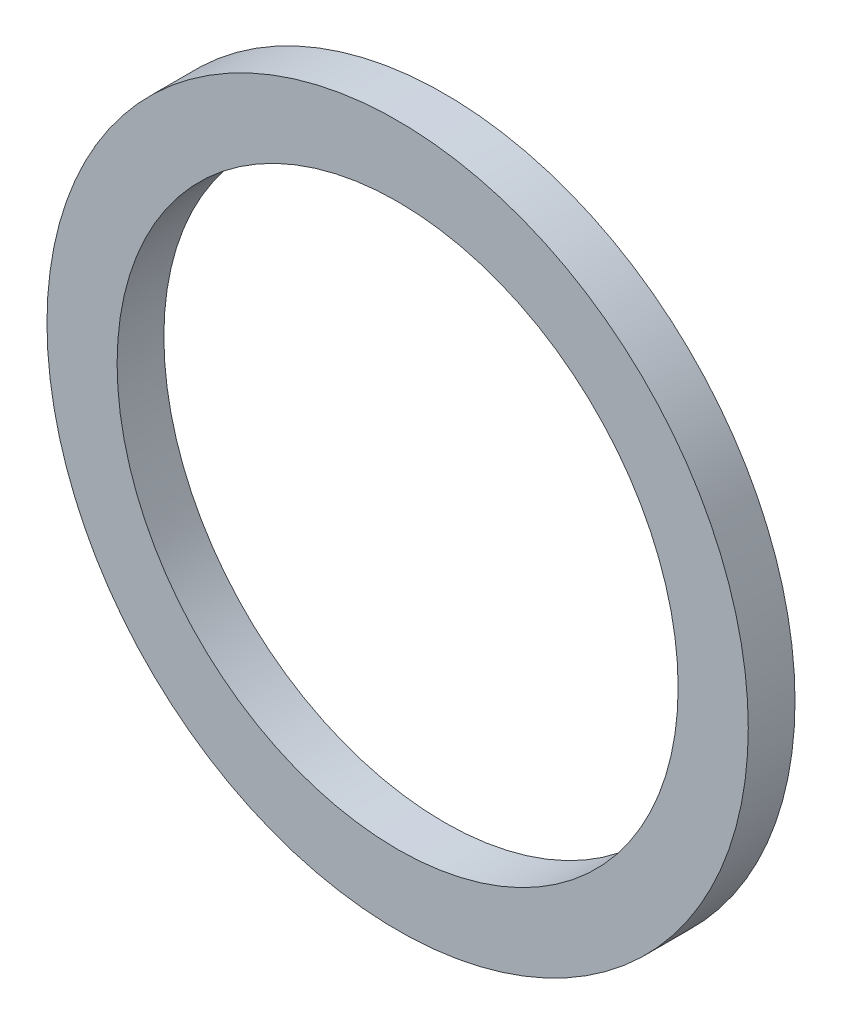
ISO-10303-21;
HEADER;
FILE_DESCRIPTION(('STEP AP214'),'2;1');
FILE_NAME('part.step','',(''),(''),'','','');
FILE_SCHEMA(('AUTOMOTIVE_DESIGN { 1 0 10303 214 1 1 1 1 }'));
ENDSEC;
DATA;
#1=APPLICATION_CONTEXT('core data for automotive mechanical design processes');
#2=APPLICATION_PROTOCOL_DEFINITION('international standard','automotive_design',2000,#1);
#3=PRODUCT_CONTEXT('',#1,'mechanical');
#4=PRODUCT('Part','Part','',(#3));
#5=PRODUCT_RELATED_PRODUCT_CATEGORY('part','',(#4));
#6=PRODUCT_DEFINITION_FORMATION('','',#4);
#7=PRODUCT_DEFINITION_CONTEXT('part definition',#1,'design');
#8=PRODUCT_DEFINITION('design','',#6,#7);
#9=PRODUCT_DEFINITION_SHAPE('','',#8);
#10=(LENGTH_UNIT() NAMED_UNIT(*) SI_UNIT(.MILLI.,.METRE.));
#11=(NAMED_UNIT(*) PLANE_ANGLE_UNIT() SI_UNIT($,.RADIAN.));
#12=(NAMED_UNIT(*) SI_UNIT($,.STERADIAN.) SOLID_ANGLE_UNIT());
#13=UNCERTAINTY_MEASURE_WITH_UNIT(LENGTH_MEASURE(1.E-05),#10,'distance_accuracy_value','');
#14=(GEOMETRIC_REPRESENTATION_CONTEXT(3) GLOBAL_UNCERTAINTY_ASSIGNED_CONTEXT((#13)) GLOBAL_UNIT_ASSIGNED_CONTEXT((#10,
#11,#12)) REPRESENTATION_CONTEXT('',''));
#15=CARTESIAN_POINT('',(0.,0.,0.));
#16=DIRECTION('',(0.,0.,1.));
#17=DIRECTION('',(1.,0.,0.));
#18=AXIS2_PLACEMENT_3D('',#15,#16,#17);
#19=CARTESIAN_POINT('',(0.,0.,1.));
#20=DIRECTION('',(0.,0.,1.));
#21=DIRECTION('',(1.,0.,0.));
#22=AXIS2_PLACEMENT_3D('',#19,#20,#21);
#23=PLANE('',#22);
#24=CARTESIAN_POINT('',(0.,0.,1.));
#25=DIRECTION('',(0.,0.,1.));
#26=DIRECTION('',(1.,0.,0.));
#27=AXIS2_PLACEMENT_3D('',#24,#25,#26);
#28=CIRCLE('',#27,7.5);
#29=CARTESIAN_POINT('',(7.5,0.,1.));
#30=VERTEX_POINT('',#29);
#31=EDGE_CURVE('E10',#30,#30,#28,.T.);
#32=ORIENTED_EDGE('',*,*,#31,.T.);
#33=EDGE_LOOP('',(#32));
#34=FACE_BOUND('',#33,.T.);
#35=CARTESIAN_POINT('',(0.,0.,1.));
#36=DIRECTION('',(0.,0.,1.));
#37=DIRECTION('',(1.,0.,0.));
#38=AXIS2_PLACEMENT_3D('',#35,#36,#37);
#39=CIRCLE('',#38,6.);
#40=CARTESIAN_POINT('',(6.,0.,1.));
#41=VERTEX_POINT('',#40);
#42=EDGE_CURVE('E50',#41,#41,#39,.T.);
#43=ORIENTED_EDGE('',*,*,#42,.F.);
#44=EDGE_LOOP('',(#43));
#45=FACE_BOUND('',#44,.T.);
#46=ADVANCED_FACE('F37',(#34,#45),#23,.T.);
#47=CARTESIAN_POINT('',(0.,0.,0.));
#48=DIRECTION('',(0.,0.,1.));
#49=DIRECTION('',(1.,0.,0.));
#50=AXIS2_PLACEMENT_3D('',#47,#48,#49);
#51=PLANE('',#50);
#52=CARTESIAN_POINT('',(0.,0.,0.));
#53=DIRECTION('',(0.,0.,1.));
#54=DIRECTION('',(1.,0.,0.));
#55=AXIS2_PLACEMENT_3D('',#52,#53,#54);
#56=CIRCLE('',#55,7.5);
#57=CARTESIAN_POINT('',(7.5,0.,0.));
#58=VERTEX_POINT('',#57);
#59=EDGE_CURVE('E41',#58,#58,#56,.T.);
#60=ORIENTED_EDGE('',*,*,#59,.F.);
#61=EDGE_LOOP('',(#60));
#62=FACE_BOUND('',#61,.T.);
#63=CARTESIAN_POINT('',(0.,0.,0.));
#64=DIRECTION('',(0.,0.,1.));
#65=DIRECTION('',(1.,0.,0.));
#66=AXIS2_PLACEMENT_3D('',#63,#64,#65);
#67=CIRCLE('',#66,6.);
#68=CARTESIAN_POINT('',(6.,0.,0.));
#69=VERTEX_POINT('',#68);
#70=EDGE_CURVE('E52',#69,#69,#67,.T.);
#71=ORIENTED_EDGE('',*,*,#70,.T.);
#72=EDGE_LOOP('',(#71));
#73=FACE_BOUND('',#72,.T.);
#74=ADVANCED_FACE('F64',(#62,#73),#51,.F.);
#75=CARTESIAN_POINT('',(0.,0.,1.));
#76=DIRECTION('',(0.,0.,-1.));
#77=DIRECTION('',(-1.,0.,0.));
#78=AXIS2_PLACEMENT_3D('',#75,#76,#77);
#79=CYLINDRICAL_SURFACE('',#78,7.5);
#80=ORIENTED_EDGE('',*,*,#31,.F.);
#81=EDGE_LOOP('',(#80));
#82=FACE_BOUND('',#81,.T.);
#83=ORIENTED_EDGE('',*,*,#59,.T.);
#84=EDGE_LOOP('',(#83));
#85=FACE_BOUND('',#84,.T.);
#86=ADVANCED_FACE('F39',(#82,#85),#79,.T.);
#87=CARTESIAN_POINT('',(0.,0.,1.));
#88=DIRECTION('',(0.,0.,-1.));
#89=DIRECTION('',(-1.,0.,0.));
#90=AXIS2_PLACEMENT_3D('',#87,#88,#89);
#91=CYLINDRICAL_SURFACE('',#90,6.);
#92=ORIENTED_EDGE('',*,*,#42,.T.);
#93=EDGE_LOOP('',(#92));
#94=FACE_BOUND('',#93,.T.);
#95=ORIENTED_EDGE('',*,*,#70,.F.);
#96=EDGE_LOOP('',(#95));
#97=FACE_BOUND('',#96,.T.);
#98=ADVANCED_FACE('F60',(#94,#97),#91,.F.);
#99=CLOSED_SHELL('',(#46,#74,#86,#98));
#100=MANIFOLD_SOLID_BREP('B2',#99);
#101=ADVANCED_BREP_SHAPE_REPRESENTATION('',(#18,#100),#14);
#102=SHAPE_DEFINITION_REPRESENTATION(#9,#101);
ENDSEC;
END-ISO-10303-21;
